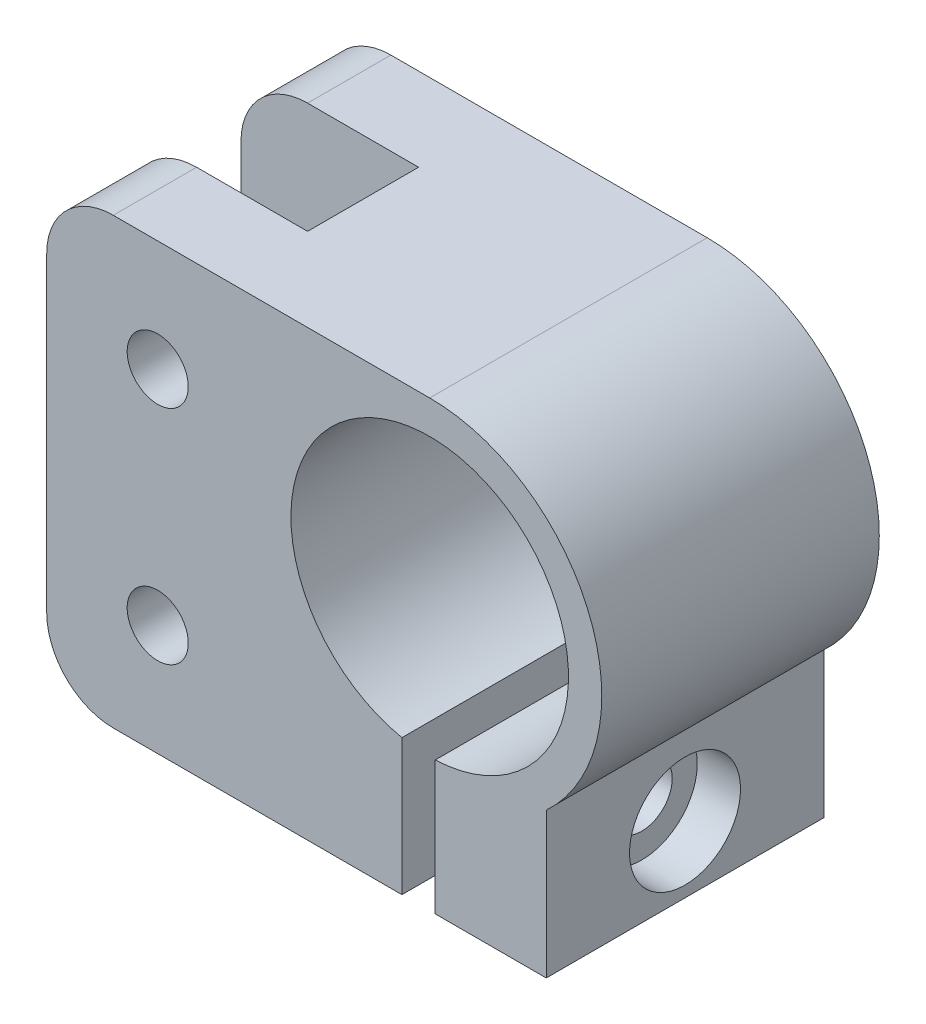
ISO-10303-21;
HEADER;
FILE_DESCRIPTION(('STEP AP214'),'2;1');
FILE_NAME('part.step','',(''),(''),'','','');
FILE_SCHEMA(('AUTOMOTIVE_DESIGN { 1 0 10303 214 1 1 1 1 }'));
ENDSEC;
DATA;
#1=APPLICATION_CONTEXT('core data for automotive mechanical design processes');
#2=APPLICATION_PROTOCOL_DEFINITION('international standard','automotive_design',2000,#1);
#3=PRODUCT_CONTEXT('',#1,'mechanical');
#4=PRODUCT('Part','Part','',(#3));
#5=PRODUCT_RELATED_PRODUCT_CATEGORY('part','',(#4));
#6=PRODUCT_DEFINITION_FORMATION('','',#4);
#7=PRODUCT_DEFINITION_CONTEXT('part definition',#1,'design');
#8=PRODUCT_DEFINITION('design','',#6,#7);
#9=PRODUCT_DEFINITION_SHAPE('','',#8);
#10=(LENGTH_UNIT() NAMED_UNIT(*) SI_UNIT(.MILLI.,.METRE.));
#11=(NAMED_UNIT(*) PLANE_ANGLE_UNIT() SI_UNIT($,.RADIAN.));
#12=(NAMED_UNIT(*) SI_UNIT($,.STERADIAN.) SOLID_ANGLE_UNIT());
#13=UNCERTAINTY_MEASURE_WITH_UNIT(LENGTH_MEASURE(1.E-05),#10,'distance_accuracy_value','');
#14=(GEOMETRIC_REPRESENTATION_CONTEXT(3) GLOBAL_UNCERTAINTY_ASSIGNED_CONTEXT((#13)) GLOBAL_UNIT_ASSIGNED_CONTEXT((#10,
#11,#12)) REPRESENTATION_CONTEXT('',''));
#15=CARTESIAN_POINT('',(0.,0.,0.));
#16=DIRECTION('',(0.,0.,1.));
#17=DIRECTION('',(1.,0.,0.));
#18=AXIS2_PLACEMENT_3D('',#15,#16,#17);
#19=CARTESIAN_POINT('',(12.,4.5,-12.5));
#20=DIRECTION('',(0.,0.,1.));
#21=DIRECTION('',(1.,0.,0.));
#22=AXIS2_PLACEMENT_3D('',#19,#20,#21);
#23=PLANE('',#22);
#24=CARTESIAN_POINT('',(-12.5,-10.,-12.5));
#25=DIRECTION('',(0.,0.,-1.));
#26=DIRECTION('',(-1.,0.,0.));
#27=AXIS2_PLACEMENT_3D('',#24,#25,#26);
#28=CIRCLE('',#27,4.99999999999999);
#29=CARTESIAN_POINT('',(-17.5,-10.,-12.5));
#30=VERTEX_POINT('',#29);
#31=EDGE_CURVE('E309',#30,#30,#28,.T.);
#32=ORIENTED_EDGE('',*,*,#31,.F.);
#33=EDGE_LOOP('',(#32));
#34=FACE_BOUND('',#33,.T.);
#35=DIRECTION('',(1.,0.,0.));
#36=VECTOR('',#35,1.);
#37=CARTESIAN_POINT('',(22.5,-20.,-12.5));
#38=LINE('',#37,#36);
#39=CARTESIAN_POINT('',(12.5,-20.,-12.5));
#40=VERTEX_POINT('',#39);
#41=CARTESIAN_POINT('',(22.5,-20.,-12.5));
#42=VERTEX_POINT('',#41);
#43=EDGE_CURVE('E240',#40,#42,#38,.T.);
#44=ORIENTED_EDGE('',*,*,#43,.F.);
#45=DIRECTION('',(0.,-1.,0.));
#46=VECTOR('',#45,1.);
#47=CARTESIAN_POINT('',(12.5,-20.,-12.5));
#48=LINE('',#47,#46);
#49=CARTESIAN_POINT('',(12.5,-7.98999599679679,-12.5));
#50=VERTEX_POINT('',#49);
#51=EDGE_CURVE('E176',#50,#40,#48,.T.);
#52=ORIENTED_EDGE('',*,*,#51,.F.);
#53=CARTESIAN_POINT('',(12.,4.5,-12.5));
#54=DIRECTION('',(0.,0.,1.));
#55=DIRECTION('',(1.,0.,0.));
#56=AXIS2_PLACEMENT_3D('',#53,#54,#55);
#57=CIRCLE('',#56,12.5);
#58=CARTESIAN_POINT('',(9.5,-7.74744871391588,-12.5));
#59=VERTEX_POINT('',#58);
#60=EDGE_CURVE('E189',#50,#59,#57,.T.);
#61=ORIENTED_EDGE('',*,*,#60,.T.);
#62=DIRECTION('',(0.,1.,0.));
#63=VECTOR('',#62,1.);
#64=CARTESIAN_POINT('',(9.5,-20.,-12.5));
#65=LINE('',#64,#63);
#66=CARTESIAN_POINT('',(9.5,-20.,-12.5));
#67=VERTEX_POINT('',#66);
#68=EDGE_CURVE('E56',#67,#59,#65,.T.);
#69=ORIENTED_EDGE('',*,*,#68,.F.);
#70=CARTESIAN_POINT('',(-16.5,-20.,-12.5));
#71=VERTEX_POINT('',#70);
#72=EDGE_CURVE('E241',#71,#67,#38,.T.);
#73=ORIENTED_EDGE('',*,*,#72,.F.);
#74=CARTESIAN_POINT('',(-16.5,-14.,-12.5));
#75=DIRECTION('',(0.,0.,1.));
#76=DIRECTION('',(1.,0.,0.));
#77=AXIS2_PLACEMENT_3D('',#74,#75,#76);
#78=CIRCLE('',#77,6.);
#79=CARTESIAN_POINT('',(-22.5,-14.,-12.5));
#80=VERTEX_POINT('',#79);
#81=EDGE_CURVE('E263',#71,#80,#78,.F.);
#82=ORIENTED_EDGE('',*,*,#81,.T.);
#83=DIRECTION('',(0.,-1.,0.));
#84=VECTOR('',#83,1.);
#85=CARTESIAN_POINT('',(-22.5,20.,-12.5));
#86=LINE('',#85,#84);
#87=CARTESIAN_POINT('',(-22.5,14.,-12.5));
#88=VERTEX_POINT('',#87);
#89=EDGE_CURVE('E214',#88,#80,#86,.T.);
#90=ORIENTED_EDGE('',*,*,#89,.F.);
#91=CARTESIAN_POINT('',(-16.5,14.,-12.5));
#92=DIRECTION('',(0.,0.,1.));
#93=DIRECTION('',(1.,0.,0.));
#94=AXIS2_PLACEMENT_3D('',#91,#92,#93);
#95=CIRCLE('',#94,6.);
#96=CARTESIAN_POINT('',(-16.5,20.,-12.5));
#97=VERTEX_POINT('',#96);
#98=EDGE_CURVE('E265',#88,#97,#95,.F.);
#99=ORIENTED_EDGE('',*,*,#98,.T.);
#100=DIRECTION('',(-1.,0.,0.));
#101=VECTOR('',#100,1.);
#102=CARTESIAN_POINT('',(12.,20.,-12.5));
#103=LINE('',#102,#101);
#104=CARTESIAN_POINT('',(12.,20.,-12.5));
#105=VERTEX_POINT('',#104);
#106=EDGE_CURVE('E226',#105,#97,#103,.T.);
#107=ORIENTED_EDGE('',*,*,#106,.F.);
#108=CARTESIAN_POINT('',(12.,4.5,-12.5));
#109=DIRECTION('',(0.,0.,1.));
#110=DIRECTION('',(1.,0.,0.));
#111=AXIS2_PLACEMENT_3D('',#108,#109,#110);
#112=CIRCLE('',#111,15.5);
#113=CARTESIAN_POINT('',(22.5,-6.90175425099139,-12.5));
#114=VERTEX_POINT('',#113);
#115=EDGE_CURVE('E246',#114,#105,#112,.T.);
#116=ORIENTED_EDGE('',*,*,#115,.F.);
#117=DIRECTION('',(0.,1.,0.));
#118=VECTOR('',#117,1.);
#119=CARTESIAN_POINT('',(22.5,-6.90175425099139,-12.5));
#120=LINE('',#119,#118);
#121=EDGE_CURVE('E244',#42,#114,#120,.T.);
#122=ORIENTED_EDGE('',*,*,#121,.F.);
#123=EDGE_LOOP('',(#44,#52,#61,#69,#73,#82,#90,#99,#107,#116,#122));
#124=FACE_BOUND('',#123,.T.);
#125=CARTESIAN_POINT('',(-12.5,10.,-12.5));
#126=DIRECTION('',(0.,0.,-1.));
#127=DIRECTION('',(-1.,0.,0.));
#128=AXIS2_PLACEMENT_3D('',#125,#126,#127);
#129=CIRCLE('',#128,4.99999999999999);
#130=CARTESIAN_POINT('',(-17.5,10.,-12.5));
#131=VERTEX_POINT('',#130);
#132=EDGE_CURVE('E471',#131,#131,#129,.T.);
#133=ORIENTED_EDGE('',*,*,#132,.F.);
#134=EDGE_LOOP('',(#133));
#135=FACE_BOUND('',#134,.T.);
#136=ADVANCED_FACE('F32',(#34,#124,#135),#23,.F.);
#137=CARTESIAN_POINT('',(22.5,-20.,12.5));
#138=DIRECTION('',(0.,1.,0.));
#139=DIRECTION('',(-1.,0.,0.));
#140=AXIS2_PLACEMENT_3D('',#137,#138,#139);
#141=PLANE('',#140);
#142=DIRECTION('',(1.,0.,0.));
#143=VECTOR('',#142,1.);
#144=CARTESIAN_POINT('',(22.5,-20.,12.5));
#145=LINE('',#144,#143);
#146=CARTESIAN_POINT('',(12.5,-20.,12.5));
#147=VERTEX_POINT('',#146);
#148=CARTESIAN_POINT('',(22.5,-20.,12.5));
#149=VERTEX_POINT('',#148);
#150=EDGE_CURVE('E225',#147,#149,#145,.T.);
#151=ORIENTED_EDGE('',*,*,#150,.F.);
#152=DIRECTION('',(0.,0.,-1.));
#153=VECTOR('',#152,1.);
#154=CARTESIAN_POINT('',(12.5,-20.,12.5));
#155=LINE('',#154,#153);
#156=EDGE_CURVE('E181',#147,#40,#155,.T.);
#157=ORIENTED_EDGE('',*,*,#156,.T.);
#158=ORIENTED_EDGE('',*,*,#43,.T.);
#159=DIRECTION('',(0.,0.,-1.));
#160=VECTOR('',#159,1.);
#161=CARTESIAN_POINT('',(22.5,-20.,12.5));
#162=LINE('',#161,#160);
#163=EDGE_CURVE('E255',#149,#42,#162,.T.);
#164=ORIENTED_EDGE('',*,*,#163,.F.);
#165=EDGE_LOOP('',(#151,#157,#158,#164));
#166=FACE_BOUND('',#165,.T.);
#167=ADVANCED_FACE('F402',(#166),#141,.F.);
#168=CARTESIAN_POINT('',(-22.5,20.,12.5));
#169=DIRECTION('',(1.,0.,0.));
#170=DIRECTION('',(0.,1.,0.));
#171=AXIS2_PLACEMENT_3D('',#168,#169,#170);
#172=PLANE('',#171);
#173=DIRECTION('',(0.,1.,0.));
#174=VECTOR('',#173,1.);
#175=CARTESIAN_POINT('',(-22.5,-20.,-5.));
#176=LINE('',#175,#174);
#177=CARTESIAN_POINT('',(-22.5,-14.,-5.));
#178=VERTEX_POINT('',#177);
#179=CARTESIAN_POINT('',(-22.5,14.,-5.));
#180=VERTEX_POINT('',#179);
#181=EDGE_CURVE('E211',#178,#180,#176,.T.);
#182=ORIENTED_EDGE('',*,*,#181,.T.);
#183=DIRECTION('',(0.,0.,-1.));
#184=VECTOR('',#183,1.);
#185=CARTESIAN_POINT('',(-22.5,14.,12.5));
#186=LINE('',#185,#184);
#187=EDGE_CURVE('E260',#180,#88,#186,.T.);
#188=ORIENTED_EDGE('',*,*,#187,.T.);
#189=ORIENTED_EDGE('',*,*,#89,.T.);
#190=DIRECTION('',(0.,0.,-1.));
#191=VECTOR('',#190,1.);
#192=CARTESIAN_POINT('',(-22.5,-14.,12.5));
#193=LINE('',#192,#191);
#194=EDGE_CURVE('E258',#80,#178,#193,.F.);
#195=ORIENTED_EDGE('',*,*,#194,.T.);
#196=EDGE_LOOP('',(#182,#188,#189,#195));
#197=FACE_BOUND('',#196,.T.);
#198=ADVANCED_FACE('F361',(#197),#172,.F.);
#199=DIRECTION('',(0.,-1.,0.));
#200=VECTOR('',#199,1.);
#201=CARTESIAN_POINT('',(-22.5,20.,12.5));
#202=LINE('',#201,#200);
#203=CARTESIAN_POINT('',(-22.5,14.,12.5));
#204=VERTEX_POINT('',#203);
#205=CARTESIAN_POINT('',(-22.5,-14.,12.5));
#206=VERTEX_POINT('',#205);
#207=EDGE_CURVE('E222',#204,#206,#202,.T.);
#208=ORIENTED_EDGE('',*,*,#207,.F.);
#209=DIRECTION('',(0.,0.,-1.));
#210=VECTOR('',#209,1.);
#211=CARTESIAN_POINT('',(-22.5,14.,12.5));
#212=LINE('',#211,#210);
#213=CARTESIAN_POINT('',(-22.5,14.,5.));
#214=VERTEX_POINT('',#213);
#215=EDGE_CURVE('E277',#204,#214,#212,.T.);
#216=ORIENTED_EDGE('',*,*,#215,.T.);
#217=DIRECTION('',(0.,1.,0.));
#218=VECTOR('',#217,1.);
#219=CARTESIAN_POINT('',(-22.5,-20.,5.));
#220=LINE('',#219,#218);
#221=CARTESIAN_POINT('',(-22.5,-14.,5.));
#222=VERTEX_POINT('',#221);
#223=EDGE_CURVE('E204',#222,#214,#220,.T.);
#224=ORIENTED_EDGE('',*,*,#223,.F.);
#225=DIRECTION('',(0.,0.,-1.));
#226=VECTOR('',#225,1.);
#227=CARTESIAN_POINT('',(-22.5,-14.,12.5));
#228=LINE('',#227,#226);
#229=EDGE_CURVE('E275',#222,#206,#228,.F.);
#230=ORIENTED_EDGE('',*,*,#229,.T.);
#231=EDGE_LOOP('',(#208,#216,#224,#230));
#232=FACE_BOUND('',#231,.T.);
#233=ADVANCED_FACE('F386',(#232),#172,.F.);
#234=ORIENTED_EDGE('',*,*,#72,.T.);
#235=DIRECTION('',(0.,0.,-1.));
#236=VECTOR('',#235,1.);
#237=CARTESIAN_POINT('',(9.5,-20.,12.5));
#238=LINE('',#237,#236);
#239=CARTESIAN_POINT('',(9.5,-20.,12.5));
#240=VERTEX_POINT('',#239);
#241=EDGE_CURVE('E184',#240,#67,#238,.T.);
#242=ORIENTED_EDGE('',*,*,#241,.F.);
#243=CARTESIAN_POINT('',(-16.5,-20.,12.5));
#244=VERTEX_POINT('',#243);
#245=EDGE_CURVE('E227',#244,#240,#145,.T.);
#246=ORIENTED_EDGE('',*,*,#245,.F.);
#247=DIRECTION('',(0.,0.,-1.));
#248=VECTOR('',#247,1.);
#249=CARTESIAN_POINT('',(-16.5,-20.,12.5));
#250=LINE('',#249,#248);
#251=CARTESIAN_POINT('',(-16.5,-20.,5.));
#252=VERTEX_POINT('',#251);
#253=EDGE_CURVE('E291',#244,#252,#250,.T.);
#254=ORIENTED_EDGE('',*,*,#253,.T.);
#255=DIRECTION('',(1.,0.,0.));
#256=VECTOR('',#255,1.);
#257=CARTESIAN_POINT('',(-22.5,-20.,5.));
#258=LINE('',#257,#256);
#259=CARTESIAN_POINT('',(-6.49999999999999,-20.,5.));
#260=VERTEX_POINT('',#259);
#261=EDGE_CURVE('E195',#252,#260,#258,.T.);
#262=ORIENTED_EDGE('',*,*,#261,.T.);
#263=DIRECTION('',(0.,0.,-1.));
#264=VECTOR('',#263,1.);
#265=CARTESIAN_POINT('',(-6.49999999999999,-20.,-5.));
#266=LINE('',#265,#264);
#267=CARTESIAN_POINT('',(-6.49999999999999,-20.,-5.));
#268=VERTEX_POINT('',#267);
#269=EDGE_CURVE('E197',#260,#268,#266,.T.);
#270=ORIENTED_EDGE('',*,*,#269,.T.);
#271=DIRECTION('',(-1.,0.,0.));
#272=VECTOR('',#271,1.);
#273=CARTESIAN_POINT('',(-22.5,-20.,-5.));
#274=LINE('',#273,#272);
#275=CARTESIAN_POINT('',(-16.5,-20.,-5.));
#276=VERTEX_POINT('',#275);
#277=EDGE_CURVE('E201',#268,#276,#274,.T.);
#278=ORIENTED_EDGE('',*,*,#277,.T.);
#279=DIRECTION('',(0.,0.,-1.));
#280=VECTOR('',#279,1.);
#281=CARTESIAN_POINT('',(-16.5,-20.,12.5));
#282=LINE('',#281,#280);
#283=EDGE_CURVE('E288',#276,#71,#282,.T.);
#284=ORIENTED_EDGE('',*,*,#283,.T.);
#285=EDGE_LOOP('',(#234,#242,#246,#254,#262,#270,#278,#284));
#286=FACE_BOUND('',#285,.T.);
#287=ADVANCED_FACE('F332',(#286),#141,.F.);
#288=CARTESIAN_POINT('',(22.5,-6.90175425099139,12.5));
#289=DIRECTION('',(-1.,0.,0.));
#290=DIRECTION('',(0.,-1.,0.));
#291=AXIS2_PLACEMENT_3D('',#288,#289,#290);
#292=PLANE('',#291);
#293=CARTESIAN_POINT('',(22.5,-14.,0.));
#294=DIRECTION('',(1.,0.,0.));
#295=DIRECTION('',(0.,0.,-1.));
#296=AXIS2_PLACEMENT_3D('',#293,#294,#295);
#297=CIRCLE('',#296,5.);
#298=CARTESIAN_POINT('',(22.5,-14.,-5.));
#299=VERTEX_POINT('',#298);
#300=EDGE_CURVE('E315',#299,#299,#297,.T.);
#301=ORIENTED_EDGE('',*,*,#300,.F.);
#302=EDGE_LOOP('',(#301));
#303=FACE_BOUND('',#302,.T.);
#304=ORIENTED_EDGE('',*,*,#121,.T.);
#305=DIRECTION('',(0.,0.,-1.));
#306=VECTOR('',#305,1.);
#307=CARTESIAN_POINT('',(22.5,-6.90175425099139,12.5));
#308=LINE('',#307,#306);
#309=CARTESIAN_POINT('',(22.5,-6.90175425099139,12.5));
#310=VERTEX_POINT('',#309);
#311=EDGE_CURVE('E252',#310,#114,#308,.T.);
#312=ORIENTED_EDGE('',*,*,#311,.F.);
#313=DIRECTION('',(0.,1.,0.));
#314=VECTOR('',#313,1.);
#315=CARTESIAN_POINT('',(22.5,-6.90175425099139,12.5));
#316=LINE('',#315,#314);
#317=EDGE_CURVE('E230',#149,#310,#316,.T.);
#318=ORIENTED_EDGE('',*,*,#317,.F.);
#319=ORIENTED_EDGE('',*,*,#163,.T.);
#320=EDGE_LOOP('',(#304,#312,#318,#319));
#321=FACE_BOUND('',#320,.T.);
#322=ADVANCED_FACE('F328',(#303,#321),#292,.F.);
#323=CARTESIAN_POINT('',(12.,4.5,12.5));
#324=DIRECTION('',(0.,0.,-1.));
#325=DIRECTION('',(-1.,0.,0.));
#326=AXIS2_PLACEMENT_3D('',#323,#324,#325);
#327=CYLINDRICAL_SURFACE('',#326,15.5);
#328=ORIENTED_EDGE('',*,*,#115,.T.);
#329=DIRECTION('',(0.,0.,-1.));
#330=VECTOR('',#329,1.);
#331=CARTESIAN_POINT('',(12.,20.,12.5));
#332=LINE('',#331,#330);
#333=CARTESIAN_POINT('',(12.,20.,12.5));
#334=VERTEX_POINT('',#333);
#335=EDGE_CURVE('E237',#334,#105,#332,.T.);
#336=ORIENTED_EDGE('',*,*,#335,.F.);
#337=CARTESIAN_POINT('',(12.,4.5,12.5));
#338=DIRECTION('',(0.,0.,1.));
#339=DIRECTION('',(1.,0.,0.));
#340=AXIS2_PLACEMENT_3D('',#337,#338,#339);
#341=CIRCLE('',#340,15.5);
#342=EDGE_CURVE('E232',#310,#334,#341,.T.);
#343=ORIENTED_EDGE('',*,*,#342,.F.);
#344=ORIENTED_EDGE('',*,*,#311,.T.);
#345=EDGE_LOOP('',(#328,#336,#343,#344));
#346=FACE_BOUND('',#345,.T.);
#347=ADVANCED_FACE('F331',(#346),#327,.T.);
#348=CARTESIAN_POINT('',(12.,20.,12.5));
#349=DIRECTION('',(0.,-1.,0.));
#350=DIRECTION('',(1.,0.,0.));
#351=AXIS2_PLACEMENT_3D('',#348,#349,#350);
#352=PLANE('',#351);
#353=ORIENTED_EDGE('',*,*,#106,.T.);
#354=DIRECTION('',(0.,0.,-1.));
#355=VECTOR('',#354,1.);
#356=CARTESIAN_POINT('',(-16.5,20.,12.5));
#357=LINE('',#356,#355);
#358=CARTESIAN_POINT('',(-16.5,20.,-5.));
#359=VERTEX_POINT('',#358);
#360=EDGE_CURVE('E269',#97,#359,#357,.F.);
#361=ORIENTED_EDGE('',*,*,#360,.T.);
#362=DIRECTION('',(-1.,0.,0.));
#363=VECTOR('',#362,1.);
#364=CARTESIAN_POINT('',(-22.5,20.,-5.));
#365=LINE('',#364,#363);
#366=CARTESIAN_POINT('',(-6.5,20.,-5.));
#367=VERTEX_POINT('',#366);
#368=EDGE_CURVE('E198',#367,#359,#365,.T.);
#369=ORIENTED_EDGE('',*,*,#368,.F.);
#370=DIRECTION('',(0.,0.,-1.));
#371=VECTOR('',#370,1.);
#372=CARTESIAN_POINT('',(-6.5,20.,-5.));
#373=LINE('',#372,#371);
#374=CARTESIAN_POINT('',(-6.5,20.,5.));
#375=VERTEX_POINT('',#374);
#376=EDGE_CURVE('E206',#375,#367,#373,.T.);
#377=ORIENTED_EDGE('',*,*,#376,.F.);
#378=DIRECTION('',(1.,0.,0.));
#379=VECTOR('',#378,1.);
#380=CARTESIAN_POINT('',(-22.5,20.,5.));
#381=LINE('',#380,#379);
#382=CARTESIAN_POINT('',(-16.5,20.,5.));
#383=VERTEX_POINT('',#382);
#384=EDGE_CURVE('E192',#383,#375,#381,.T.);
#385=ORIENTED_EDGE('',*,*,#384,.F.);
#386=DIRECTION('',(0.,0.,-1.));
#387=VECTOR('',#386,1.);
#388=CARTESIAN_POINT('',(-16.5,20.,12.5));
#389=LINE('',#388,#387);
#390=CARTESIAN_POINT('',(-16.5,20.,12.5));
#391=VERTEX_POINT('',#390);
#392=EDGE_CURVE('E267',#383,#391,#389,.F.);
#393=ORIENTED_EDGE('',*,*,#392,.T.);
#394=DIRECTION('',(-1.,0.,0.));
#395=VECTOR('',#394,1.);
#396=CARTESIAN_POINT('',(12.,20.,12.5));
#397=LINE('',#396,#395);
#398=EDGE_CURVE('E234',#334,#391,#397,.T.);
#399=ORIENTED_EDGE('',*,*,#398,.F.);
#400=ORIENTED_EDGE('',*,*,#335,.T.);
#401=EDGE_LOOP('',(#353,#361,#369,#377,#385,#393,#399,#400));
#402=FACE_BOUND('',#401,.T.);
#403=ADVANCED_FACE('F349',(#402),#352,.F.);
#404=CARTESIAN_POINT('',(12.,4.5,12.5));
#405=DIRECTION('',(0.,0.,1.));
#406=DIRECTION('',(1.,0.,0.));
#407=AXIS2_PLACEMENT_3D('',#404,#405,#406);
#408=PLANE('',#407);
#409=CARTESIAN_POINT('',(-12.5,10.,12.5));
#410=DIRECTION('',(0.,0.,1.));
#411=DIRECTION('',(1.,0.,0.));
#412=AXIS2_PLACEMENT_3D('',#409,#410,#411);
#413=CIRCLE('',#412,2.75);
#414=CARTESIAN_POINT('',(-9.75,10.,12.5));
#415=VERTEX_POINT('',#414);
#416=EDGE_CURVE('E460',#415,#415,#413,.T.);
#417=ORIENTED_EDGE('',*,*,#416,.F.);
#418=EDGE_LOOP('',(#417));
#419=FACE_BOUND('',#418,.T.);
#420=CARTESIAN_POINT('',(-12.5,-10.,12.5));
#421=DIRECTION('',(0.,0.,1.));
#422=DIRECTION('',(1.,0.,0.));
#423=AXIS2_PLACEMENT_3D('',#420,#421,#422);
#424=CIRCLE('',#423,2.75);
#425=CARTESIAN_POINT('',(-9.75,-10.,12.5));
#426=VERTEX_POINT('',#425);
#427=EDGE_CURVE('E296',#426,#426,#424,.T.);
#428=ORIENTED_EDGE('',*,*,#427,.F.);
#429=EDGE_LOOP('',(#428));
#430=FACE_BOUND('',#429,.T.);
#431=DIRECTION('',(0.,-1.,0.));
#432=VECTOR('',#431,1.);
#433=CARTESIAN_POINT('',(12.5,-20.,12.5));
#434=LINE('',#433,#432);
#435=CARTESIAN_POINT('',(12.5,-7.98999599679679,12.5));
#436=VERTEX_POINT('',#435);
#437=EDGE_CURVE('E49',#436,#147,#434,.T.);
#438=ORIENTED_EDGE('',*,*,#437,.T.);
#439=ORIENTED_EDGE('',*,*,#150,.T.);
#440=ORIENTED_EDGE('',*,*,#317,.T.);
#441=ORIENTED_EDGE('',*,*,#342,.T.);
#442=ORIENTED_EDGE('',*,*,#398,.T.);
#443=CARTESIAN_POINT('',(-16.5,14.,12.5));
#444=DIRECTION('',(0.,0.,1.));
#445=DIRECTION('',(1.,0.,0.));
#446=AXIS2_PLACEMENT_3D('',#443,#444,#445);
#447=CIRCLE('',#446,6.);
#448=EDGE_CURVE('E286',#391,#204,#447,.T.);
#449=ORIENTED_EDGE('',*,*,#448,.T.);
#450=ORIENTED_EDGE('',*,*,#207,.T.);
#451=CARTESIAN_POINT('',(-16.5,-14.,12.5));
#452=DIRECTION('',(0.,0.,1.));
#453=DIRECTION('',(1.,0.,0.));
#454=AXIS2_PLACEMENT_3D('',#451,#452,#453);
#455=CIRCLE('',#454,6.);
#456=EDGE_CURVE('E284',#206,#244,#455,.T.);
#457=ORIENTED_EDGE('',*,*,#456,.T.);
#458=ORIENTED_EDGE('',*,*,#245,.T.);
#459=DIRECTION('',(0.,1.,0.));
#460=VECTOR('',#459,1.);
#461=CARTESIAN_POINT('',(9.5,-20.,12.5));
#462=LINE('',#461,#460);
#463=CARTESIAN_POINT('',(9.5,-7.74744871391588,12.5));
#464=VERTEX_POINT('',#463);
#465=EDGE_CURVE('E178',#240,#464,#462,.T.);
#466=ORIENTED_EDGE('',*,*,#465,.T.);
#467=CARTESIAN_POINT('',(12.,4.5,12.5));
#468=DIRECTION('',(0.,0.,1.));
#469=DIRECTION('',(1.,0.,0.));
#470=AXIS2_PLACEMENT_3D('',#467,#468,#469);
#471=CIRCLE('',#470,12.5);
#472=EDGE_CURVE('E186',#436,#464,#471,.T.);
#473=ORIENTED_EDGE('',*,*,#472,.F.);
#474=EDGE_LOOP('',(#438,#439,#440,#441,#442,#449,#450,#457,#458,#466,#473));
#475=FACE_BOUND('',#474,.T.);
#476=ADVANCED_FACE('F383',(#419,#430,#475),#408,.T.);
#477=CARTESIAN_POINT('',(-22.5,-20.,-5.));
#478=DIRECTION('',(0.,0.,-1.));
#479=DIRECTION('',(-1.,0.,0.));
#480=AXIS2_PLACEMENT_3D('',#477,#478,#479);
#481=PLANE('',#480);
#482=CARTESIAN_POINT('',(-12.5,10.,-5.));
#483=DIRECTION('',(0.,0.,-1.));
#484=DIRECTION('',(-1.,0.,0.));
#485=AXIS2_PLACEMENT_3D('',#482,#483,#484);
#486=CIRCLE('',#485,2.75);
#487=CARTESIAN_POINT('',(-15.25,10.,-5.));
#488=VERTEX_POINT('',#487);
#489=EDGE_CURVE('E463',#488,#488,#486,.T.);
#490=ORIENTED_EDGE('',*,*,#489,.T.);
#491=EDGE_LOOP('',(#490));
#492=FACE_BOUND('',#491,.T.);
#493=CARTESIAN_POINT('',(-12.5,-10.,-5.));
#494=DIRECTION('',(0.,0.,-1.));
#495=DIRECTION('',(-1.,0.,0.));
#496=AXIS2_PLACEMENT_3D('',#493,#494,#495);
#497=CIRCLE('',#496,2.75);
#498=CARTESIAN_POINT('',(-15.25,-10.,-5.));
#499=VERTEX_POINT('',#498);
#500=EDGE_CURVE('E301',#499,#499,#497,.T.);
#501=ORIENTED_EDGE('',*,*,#500,.T.);
#502=EDGE_LOOP('',(#501));
#503=FACE_BOUND('',#502,.T.);
#504=ORIENTED_EDGE('',*,*,#368,.T.);
#505=CARTESIAN_POINT('',(-16.5,14.,-5.));
#506=DIRECTION('',(0.,0.,-1.));
#507=DIRECTION('',(-1.,0.,0.));
#508=AXIS2_PLACEMENT_3D('',#505,#506,#507);
#509=CIRCLE('',#508,6.);
#510=EDGE_CURVE('E273',#359,#180,#509,.F.);
#511=ORIENTED_EDGE('',*,*,#510,.T.);
#512=ORIENTED_EDGE('',*,*,#181,.F.);
#513=CARTESIAN_POINT('',(-16.5,-14.,-5.));
#514=DIRECTION('',(0.,0.,-1.));
#515=DIRECTION('',(-1.,0.,0.));
#516=AXIS2_PLACEMENT_3D('',#513,#514,#515);
#517=CIRCLE('',#516,6.);
#518=EDGE_CURVE('E271',#178,#276,#517,.F.);
#519=ORIENTED_EDGE('',*,*,#518,.T.);
#520=ORIENTED_EDGE('',*,*,#277,.F.);
#521=DIRECTION('',(0.,1.,0.));
#522=VECTOR('',#521,1.);
#523=CARTESIAN_POINT('',(-6.49999999999999,-20.,-5.));
#524=LINE('',#523,#522);
#525=EDGE_CURVE('E215',#268,#367,#524,.T.);
#526=ORIENTED_EDGE('',*,*,#525,.T.);
#527=EDGE_LOOP('',(#504,#511,#512,#519,#520,#526));
#528=FACE_BOUND('',#527,.T.);
#529=ADVANCED_FACE('F358',(#492,#503,#528),#481,.F.);
#530=CARTESIAN_POINT('',(-6.49999999999999,-20.,-5.));
#531=DIRECTION('',(1.,0.,0.));
#532=DIRECTION('',(0.,1.,0.));
#533=AXIS2_PLACEMENT_3D('',#530,#531,#532);
#534=PLANE('',#533);
#535=ORIENTED_EDGE('',*,*,#376,.T.);
#536=ORIENTED_EDGE('',*,*,#525,.F.);
#537=ORIENTED_EDGE('',*,*,#269,.F.);
#538=DIRECTION('',(0.,1.,0.));
#539=VECTOR('',#538,1.);
#540=CARTESIAN_POINT('',(-6.49999999999999,-20.,5.));
#541=LINE('',#540,#539);
#542=EDGE_CURVE('E217',#260,#375,#541,.T.);
#543=ORIENTED_EDGE('',*,*,#542,.T.);
#544=EDGE_LOOP('',(#535,#536,#537,#543));
#545=FACE_BOUND('',#544,.T.);
#546=ADVANCED_FACE('F372',(#545),#534,.F.);
#547=CARTESIAN_POINT('',(-22.5,-20.,5.));
#548=DIRECTION('',(0.,0.,1.));
#549=DIRECTION('',(1.,0.,0.));
#550=AXIS2_PLACEMENT_3D('',#547,#548,#549);
#551=PLANE('',#550);
#552=CARTESIAN_POINT('',(-12.5,10.,5.));
#553=DIRECTION('',(0.,0.,1.));
#554=DIRECTION('',(1.,0.,0.));
#555=AXIS2_PLACEMENT_3D('',#552,#553,#554);
#556=CIRCLE('',#555,2.75);
#557=CARTESIAN_POINT('',(-9.75,10.,5.));
#558=VERTEX_POINT('',#557);
#559=EDGE_CURVE('E36',#558,#558,#556,.T.);
#560=ORIENTED_EDGE('',*,*,#559,.T.);
#561=EDGE_LOOP('',(#560));
#562=FACE_BOUND('',#561,.T.);
#563=CARTESIAN_POINT('',(-12.5,-10.,5.));
#564=DIRECTION('',(0.,0.,1.));
#565=DIRECTION('',(1.,0.,0.));
#566=AXIS2_PLACEMENT_3D('',#563,#564,#565);
#567=CIRCLE('',#566,2.75);
#568=CARTESIAN_POINT('',(-9.75,-10.,5.));
#569=VERTEX_POINT('',#568);
#570=EDGE_CURVE('E294',#569,#569,#567,.T.);
#571=ORIENTED_EDGE('',*,*,#570,.T.);
#572=EDGE_LOOP('',(#571));
#573=FACE_BOUND('',#572,.T.);
#574=ORIENTED_EDGE('',*,*,#223,.T.);
#575=CARTESIAN_POINT('',(-16.5,14.,5.));
#576=DIRECTION('',(0.,0.,1.));
#577=DIRECTION('',(1.,0.,0.));
#578=AXIS2_PLACEMENT_3D('',#575,#576,#577);
#579=CIRCLE('',#578,6.);
#580=EDGE_CURVE('E282',#214,#383,#579,.F.);
#581=ORIENTED_EDGE('',*,*,#580,.T.);
#582=ORIENTED_EDGE('',*,*,#384,.T.);
#583=ORIENTED_EDGE('',*,*,#542,.F.);
#584=ORIENTED_EDGE('',*,*,#261,.F.);
#585=CARTESIAN_POINT('',(-16.5,-14.,5.));
#586=DIRECTION('',(0.,0.,1.));
#587=DIRECTION('',(1.,0.,0.));
#588=AXIS2_PLACEMENT_3D('',#585,#586,#587);
#589=CIRCLE('',#588,6.);
#590=EDGE_CURVE('E280',#252,#222,#589,.F.);
#591=ORIENTED_EDGE('',*,*,#590,.T.);
#592=EDGE_LOOP('',(#574,#581,#582,#583,#584,#591));
#593=FACE_BOUND('',#592,.T.);
#594=ADVANCED_FACE('F437',(#562,#573,#593),#551,.F.);
#595=CARTESIAN_POINT('',(-16.5,14.,12.5));
#596=DIRECTION('',(0.,0.,-1.));
#597=DIRECTION('',(-1.,0.,0.));
#598=AXIS2_PLACEMENT_3D('',#595,#596,#597);
#599=CYLINDRICAL_SURFACE('',#598,6.);
#600=ORIENTED_EDGE('',*,*,#510,.F.);
#601=ORIENTED_EDGE('',*,*,#360,.F.);
#602=ORIENTED_EDGE('',*,*,#98,.F.);
#603=ORIENTED_EDGE('',*,*,#187,.F.);
#604=EDGE_LOOP('',(#600,#601,#602,#603));
#605=FACE_BOUND('',#604,.T.);
#606=ADVANCED_FACE('F354',(#605),#599,.T.);
#607=CARTESIAN_POINT('',(-16.5,14.,12.5));
#608=DIRECTION('',(0.,0.,-1.));
#609=DIRECTION('',(-1.,0.,0.));
#610=AXIS2_PLACEMENT_3D('',#607,#608,#609);
#611=CYLINDRICAL_SURFACE('',#610,6.);
#612=ORIENTED_EDGE('',*,*,#448,.F.);
#613=ORIENTED_EDGE('',*,*,#392,.F.);
#614=ORIENTED_EDGE('',*,*,#580,.F.);
#615=ORIENTED_EDGE('',*,*,#215,.F.);
#616=EDGE_LOOP('',(#612,#613,#614,#615));
#617=FACE_BOUND('',#616,.T.);
#618=ADVANCED_FACE('F379',(#617),#611,.T.);
#619=CARTESIAN_POINT('',(-16.5,-14.,12.5));
#620=DIRECTION('',(0.,0.,-1.));
#621=DIRECTION('',(-1.,0.,0.));
#622=AXIS2_PLACEMENT_3D('',#619,#620,#621);
#623=CYLINDRICAL_SURFACE('',#622,6.);
#624=ORIENTED_EDGE('',*,*,#456,.F.);
#625=ORIENTED_EDGE('',*,*,#229,.F.);
#626=ORIENTED_EDGE('',*,*,#590,.F.);
#627=ORIENTED_EDGE('',*,*,#253,.F.);
#628=EDGE_LOOP('',(#624,#625,#626,#627));
#629=FACE_BOUND('',#628,.T.);
#630=ADVANCED_FACE('F390',(#629),#623,.T.);
#631=CARTESIAN_POINT('',(-16.5,-14.,12.5));
#632=DIRECTION('',(0.,0.,-1.));
#633=DIRECTION('',(-1.,0.,0.));
#634=AXIS2_PLACEMENT_3D('',#631,#632,#633);
#635=CYLINDRICAL_SURFACE('',#634,6.);
#636=ORIENTED_EDGE('',*,*,#518,.F.);
#637=ORIENTED_EDGE('',*,*,#194,.F.);
#638=ORIENTED_EDGE('',*,*,#81,.F.);
#639=ORIENTED_EDGE('',*,*,#283,.F.);
#640=EDGE_LOOP('',(#636,#637,#638,#639));
#641=FACE_BOUND('',#640,.T.);
#642=ADVANCED_FACE('F34',(#641),#635,.T.);
#643=CARTESIAN_POINT('',(12.,4.5,-12.5));
#644=DIRECTION('',(0.,0.,1.));
#645=DIRECTION('',(1.,0.,0.));
#646=AXIS2_PLACEMENT_3D('',#643,#644,#645);
#647=CYLINDRICAL_SURFACE('',#646,12.5);
#648=ORIENTED_EDGE('',*,*,#60,.F.);
#649=DIRECTION('',(0.,0.,1.));
#650=VECTOR('',#649,1.);
#651=CARTESIAN_POINT('',(12.5,-7.98999599679679,-12.5));
#652=LINE('',#651,#650);
#653=EDGE_CURVE('E11',#50,#436,#652,.T.);
#654=ORIENTED_EDGE('',*,*,#653,.T.);
#655=ORIENTED_EDGE('',*,*,#472,.T.);
#656=DIRECTION('',(0.,0.,1.));
#657=VECTOR('',#656,1.);
#658=CARTESIAN_POINT('',(9.5,-7.74744871391588,-12.5));
#659=LINE('',#658,#657);
#660=EDGE_CURVE('E41',#464,#59,#659,.F.);
#661=ORIENTED_EDGE('',*,*,#660,.T.);
#662=EDGE_LOOP('',(#648,#654,#655,#661));
#663=FACE_BOUND('',#662,.T.);
#664=ADVANCED_FACE('F398',(#663),#647,.F.);
#665=CARTESIAN_POINT('',(9.5,-20.,12.5));
#666=DIRECTION('',(-1.,0.,0.));
#667=DIRECTION('',(0.,0.,1.));
#668=AXIS2_PLACEMENT_3D('',#665,#666,#667);
#669=PLANE('',#668);
#670=CARTESIAN_POINT('',(9.5,-14.,0.));
#671=DIRECTION('',(-1.,0.,0.));
#672=DIRECTION('',(0.,0.,1.));
#673=AXIS2_PLACEMENT_3D('',#670,#671,#672);
#674=CIRCLE('',#673,2.75);
#675=CARTESIAN_POINT('',(9.5,-14.,2.75));
#676=VERTEX_POINT('',#675);
#677=EDGE_CURVE('E163',#676,#676,#674,.T.);
#678=ORIENTED_EDGE('',*,*,#677,.T.);
#679=EDGE_LOOP('',(#678));
#680=FACE_BOUND('',#679,.T.);
#681=ORIENTED_EDGE('',*,*,#465,.F.);
#682=ORIENTED_EDGE('',*,*,#241,.T.);
#683=ORIENTED_EDGE('',*,*,#68,.T.);
#684=ORIENTED_EDGE('',*,*,#660,.F.);
#685=EDGE_LOOP('',(#681,#682,#683,#684));
#686=FACE_BOUND('',#685,.T.);
#687=ADVANCED_FACE('F394',(#680,#686),#669,.F.);
#688=CARTESIAN_POINT('',(12.5,-20.,12.5));
#689=DIRECTION('',(1.,0.,0.));
#690=DIRECTION('',(0.,1.,0.));
#691=AXIS2_PLACEMENT_3D('',#688,#689,#690);
#692=PLANE('',#691);
#693=CARTESIAN_POINT('',(12.5,-14.,0.));
#694=DIRECTION('',(1.,0.,0.));
#695=DIRECTION('',(0.,1.,0.));
#696=AXIS2_PLACEMENT_3D('',#693,#694,#695);
#697=CIRCLE('',#696,2.75);
#698=CARTESIAN_POINT('',(12.5,-11.25,0.));
#699=VERTEX_POINT('',#698);
#700=EDGE_CURVE('E167',#699,#699,#697,.T.);
#701=ORIENTED_EDGE('',*,*,#700,.T.);
#702=EDGE_LOOP('',(#701));
#703=FACE_BOUND('',#702,.T.);
#704=ORIENTED_EDGE('',*,*,#51,.T.);
#705=ORIENTED_EDGE('',*,*,#156,.F.);
#706=ORIENTED_EDGE('',*,*,#437,.F.);
#707=ORIENTED_EDGE('',*,*,#653,.F.);
#708=EDGE_LOOP('',(#704,#705,#706,#707));
#709=FACE_BOUND('',#708,.T.);
#710=ADVANCED_FACE('F403',(#703,#709),#692,.F.);
#711=CARTESIAN_POINT('',(22.5,-14.,0.));
#712=DIRECTION('',(1.,0.,0.));
#713=DIRECTION('',(0.,0.,-1.));
#714=AXIS2_PLACEMENT_3D('',#711,#712,#713);
#715=CYLINDRICAL_SURFACE('',#714,2.75);
#716=CARTESIAN_POINT('',(18.6,-14.,0.));
#717=DIRECTION('',(1.,0.,0.));
#718=DIRECTION('',(0.,0.,-1.));
#719=AXIS2_PLACEMENT_3D('',#716,#717,#718);
#720=CIRCLE('',#719,2.75);
#721=CARTESIAN_POINT('',(18.6,-14.,-2.75));
#722=VERTEX_POINT('',#721);
#723=EDGE_CURVE('E164',#722,#722,#720,.T.);
#724=ORIENTED_EDGE('',*,*,#723,.T.);
#725=EDGE_LOOP('',(#724));
#726=FACE_BOUND('',#725,.T.);
#727=ORIENTED_EDGE('',*,*,#700,.F.);
#728=EDGE_LOOP('',(#727));
#729=FACE_BOUND('',#728,.T.);
#730=ADVANCED_FACE('F405',(#726,#729),#715,.F.);
#731=CARTESIAN_POINT('',(18.6,-11.25,0.));
#732=DIRECTION('',(-1.,0.,0.));
#733=DIRECTION('',(0.,0.,1.));
#734=AXIS2_PLACEMENT_3D('',#731,#732,#733);
#735=PLANE('',#734);
#736=ORIENTED_EDGE('',*,*,#723,.F.);
#737=EDGE_LOOP('',(#736));
#738=FACE_BOUND('',#737,.T.);
#739=CARTESIAN_POINT('',(18.6,-14.,0.));
#740=DIRECTION('',(1.,0.,0.));
#741=DIRECTION('',(0.,0.,-1.));
#742=AXIS2_PLACEMENT_3D('',#739,#740,#741);
#743=CIRCLE('',#742,5.);
#744=CARTESIAN_POINT('',(18.6,-14.,-5.));
#745=VERTEX_POINT('',#744);
#746=EDGE_CURVE('E170',#745,#745,#743,.T.);
#747=ORIENTED_EDGE('',*,*,#746,.T.);
#748=EDGE_LOOP('',(#747));
#749=FACE_BOUND('',#748,.T.);
#750=ADVANCED_FACE('F320',(#738,#749),#735,.F.);
#751=CARTESIAN_POINT('',(22.5,-14.,0.));
#752=DIRECTION('',(1.,0.,0.));
#753=DIRECTION('',(0.,0.,-1.));
#754=AXIS2_PLACEMENT_3D('',#751,#752,#753);
#755=CYLINDRICAL_SURFACE('',#754,5.);
#756=ORIENTED_EDGE('',*,*,#746,.F.);
#757=EDGE_LOOP('',(#756));
#758=FACE_BOUND('',#757,.T.);
#759=ORIENTED_EDGE('',*,*,#300,.T.);
#760=EDGE_LOOP('',(#759));
#761=FACE_BOUND('',#760,.T.);
#762=ADVANCED_FACE('F322',(#758,#761),#755,.F.);
#763=CARTESIAN_POINT('',(-4.5,-14.,0.));
#764=DIRECTION('',(1.,0.,0.));
#765=DIRECTION('',(0.,0.,-1.));
#766=AXIS2_PLACEMENT_3D('',#763,#764,#765);
#767=CIRCLE('',#766,2.74999999999999);
#768=CARTESIAN_POINT('',(-4.5,-14.,-2.74999999999999));
#769=VERTEX_POINT('',#768);
#770=EDGE_CURVE('E161',#769,#769,#767,.T.);
#771=ORIENTED_EDGE('',*,*,#770,.F.);
#772=EDGE_LOOP('',(#771));
#773=FACE_BOUND('',#772,.T.);
#774=ORIENTED_EDGE('',*,*,#677,.F.);
#775=EDGE_LOOP('',(#774));
#776=FACE_BOUND('',#775,.T.);
#777=ADVANCED_FACE('F157',(#773,#776),#715,.F.);
#778=CARTESIAN_POINT('',(-4.5,-14.,0.));
#779=DIRECTION('',(1.,0.,0.));
#780=DIRECTION('',(0.,0.,-1.));
#781=AXIS2_PLACEMENT_3D('',#778,#779,#780);
#782=CONICAL_SURFACE('',#781,2.74999999999999,1.02974425867665);
#783=CARTESIAN_POINT('',(-6.15236670232579,-14.,0.));
#784=VERTEX_POINT('',#783);
#785=VERTEX_LOOP('',#784);
#786=FACE_BOUND('',#785,.T.);
#787=ORIENTED_EDGE('',*,*,#770,.T.);
#788=EDGE_LOOP('',(#787));
#789=FACE_BOUND('',#788,.T.);
#790=ADVANCED_FACE('F153',(#786,#789),#782,.F.);
#791=CARTESIAN_POINT('',(-12.5,-10.,-12.5));
#792=DIRECTION('',(0.,0.,-1.));
#793=DIRECTION('',(-1.,0.,0.));
#794=AXIS2_PLACEMENT_3D('',#791,#792,#793);
#795=CYLINDRICAL_SURFACE('',#794,2.75);
#796=ORIENTED_EDGE('',*,*,#427,.T.);
#797=EDGE_LOOP('',(#796));
#798=FACE_BOUND('',#797,.T.);
#799=ORIENTED_EDGE('',*,*,#570,.F.);
#800=EDGE_LOOP('',(#799));
#801=FACE_BOUND('',#800,.T.);
#802=ADVANCED_FACE('F156',(#798,#801),#795,.F.);
#803=CARTESIAN_POINT('',(-12.5,-10.,-8.6));
#804=DIRECTION('',(0.,0.,-1.));
#805=DIRECTION('',(-1.,0.,0.));
#806=AXIS2_PLACEMENT_3D('',#803,#804,#805);
#807=CIRCLE('',#806,2.75);
#808=CARTESIAN_POINT('',(-15.25,-10.,-8.6));
#809=VERTEX_POINT('',#808);
#810=EDGE_CURVE('E297',#809,#809,#807,.T.);
#811=ORIENTED_EDGE('',*,*,#810,.T.);
#812=EDGE_LOOP('',(#811));
#813=FACE_BOUND('',#812,.T.);
#814=ORIENTED_EDGE('',*,*,#500,.F.);
#815=EDGE_LOOP('',(#814));
#816=FACE_BOUND('',#815,.T.);
#817=ADVANCED_FACE('F491',(#813,#816),#795,.F.);
#818=CARTESIAN_POINT('',(-9.75,-10.,-8.6));
#819=DIRECTION('',(0.,0.,1.));
#820=DIRECTION('',(1.,0.,0.));
#821=AXIS2_PLACEMENT_3D('',#818,#819,#820);
#822=PLANE('',#821);
#823=ORIENTED_EDGE('',*,*,#810,.F.);
#824=EDGE_LOOP('',(#823));
#825=FACE_BOUND('',#824,.T.);
#826=CARTESIAN_POINT('',(-12.5,-10.,-8.6));
#827=DIRECTION('',(0.,0.,-1.));
#828=DIRECTION('',(-1.,0.,0.));
#829=AXIS2_PLACEMENT_3D('',#826,#827,#828);
#830=CIRCLE('',#829,4.99999999999999);
#831=CARTESIAN_POINT('',(-17.5,-10.,-8.6));
#832=VERTEX_POINT('',#831);
#833=EDGE_CURVE('E304',#832,#832,#830,.T.);
#834=ORIENTED_EDGE('',*,*,#833,.T.);
#835=EDGE_LOOP('',(#834));
#836=FACE_BOUND('',#835,.T.);
#837=ADVANCED_FACE('F481',(#825,#836),#822,.F.);
#838=CARTESIAN_POINT('',(-12.5,-10.,-12.5));
#839=DIRECTION('',(0.,0.,-1.));
#840=DIRECTION('',(-1.,0.,0.));
#841=AXIS2_PLACEMENT_3D('',#838,#839,#840);
#842=CYLINDRICAL_SURFACE('',#841,4.99999999999999);
#843=ORIENTED_EDGE('',*,*,#833,.F.);
#844=EDGE_LOOP('',(#843));
#845=FACE_BOUND('',#844,.T.);
#846=ORIENTED_EDGE('',*,*,#31,.T.);
#847=EDGE_LOOP('',(#846));
#848=FACE_BOUND('',#847,.T.);
#849=ADVANCED_FACE('F478',(#845,#848),#842,.F.);
#850=CARTESIAN_POINT('',(-12.5,10.,-12.5));
#851=DIRECTION('',(0.,0.,-1.));
#852=DIRECTION('',(-1.,0.,0.));
#853=AXIS2_PLACEMENT_3D('',#850,#851,#852);
#854=CYLINDRICAL_SURFACE('',#853,2.75);
#855=ORIENTED_EDGE('',*,*,#416,.T.);
#856=EDGE_LOOP('',(#855));
#857=FACE_BOUND('',#856,.T.);
#858=ORIENTED_EDGE('',*,*,#559,.F.);
#859=EDGE_LOOP('',(#858));
#860=FACE_BOUND('',#859,.T.);
#861=ADVANCED_FACE('F480',(#857,#860),#854,.F.);
#862=CARTESIAN_POINT('',(-12.5,10.,-8.6));
#863=DIRECTION('',(0.,0.,-1.));
#864=DIRECTION('',(-1.,0.,0.));
#865=AXIS2_PLACEMENT_3D('',#862,#863,#864);
#866=CIRCLE('',#865,2.75);
#867=CARTESIAN_POINT('',(-15.25,10.,-8.6));
#868=VERTEX_POINT('',#867);
#869=EDGE_CURVE('E461',#868,#868,#866,.T.);
#870=ORIENTED_EDGE('',*,*,#869,.T.);
#871=EDGE_LOOP('',(#870));
#872=FACE_BOUND('',#871,.T.);
#873=ORIENTED_EDGE('',*,*,#489,.F.);
#874=EDGE_LOOP('',(#873));
#875=FACE_BOUND('',#874,.T.);
#876=ADVANCED_FACE('F488',(#872,#875),#854,.F.);
#877=CARTESIAN_POINT('',(-9.75,10.,-8.6));
#878=DIRECTION('',(0.,0.,1.));
#879=DIRECTION('',(1.,0.,0.));
#880=AXIS2_PLACEMENT_3D('',#877,#878,#879);
#881=PLANE('',#880);
#882=ORIENTED_EDGE('',*,*,#869,.F.);
#883=EDGE_LOOP('',(#882));
#884=FACE_BOUND('',#883,.T.);
#885=CARTESIAN_POINT('',(-12.5,10.,-8.6));
#886=DIRECTION('',(0.,0.,-1.));
#887=DIRECTION('',(-1.,0.,0.));
#888=AXIS2_PLACEMENT_3D('',#885,#886,#887);
#889=CIRCLE('',#888,4.99999999999999);
#890=CARTESIAN_POINT('',(-17.5,10.,-8.6));
#891=VERTEX_POINT('',#890);
#892=EDGE_CURVE('E466',#891,#891,#889,.T.);
#893=ORIENTED_EDGE('',*,*,#892,.T.);
#894=EDGE_LOOP('',(#893));
#895=FACE_BOUND('',#894,.T.);
#896=ADVANCED_FACE('F554',(#884,#895),#881,.F.);
#897=CARTESIAN_POINT('',(-12.5,10.,-12.5));
#898=DIRECTION('',(0.,0.,-1.));
#899=DIRECTION('',(-1.,0.,0.));
#900=AXIS2_PLACEMENT_3D('',#897,#898,#899);
#901=CYLINDRICAL_SURFACE('',#900,4.99999999999999);
#902=ORIENTED_EDGE('',*,*,#892,.F.);
#903=EDGE_LOOP('',(#902));
#904=FACE_BOUND('',#903,.T.);
#905=ORIENTED_EDGE('',*,*,#132,.T.);
#906=EDGE_LOOP('',(#905));
#907=FACE_BOUND('',#906,.T.);
#908=ADVANCED_FACE('F562',(#904,#907),#901,.F.);
#909=CLOSED_SHELL('',(#136,#167,#198,#233,#287,#322,#347,#403,#476,#529,#546,#594,#606,#618,
#630,#642,#664,#687,#710,#730,#750,#762,#777,#790,#802,#817,#837,#849,#861,#876,#896,#908));
#910=MANIFOLD_SOLID_BREP('B2',#909);
#911=ADVANCED_BREP_SHAPE_REPRESENTATION('',(#18,#910),#14);
#912=SHAPE_DEFINITION_REPRESENTATION(#9,#911);
ENDSEC;
END-ISO-10303-21;
